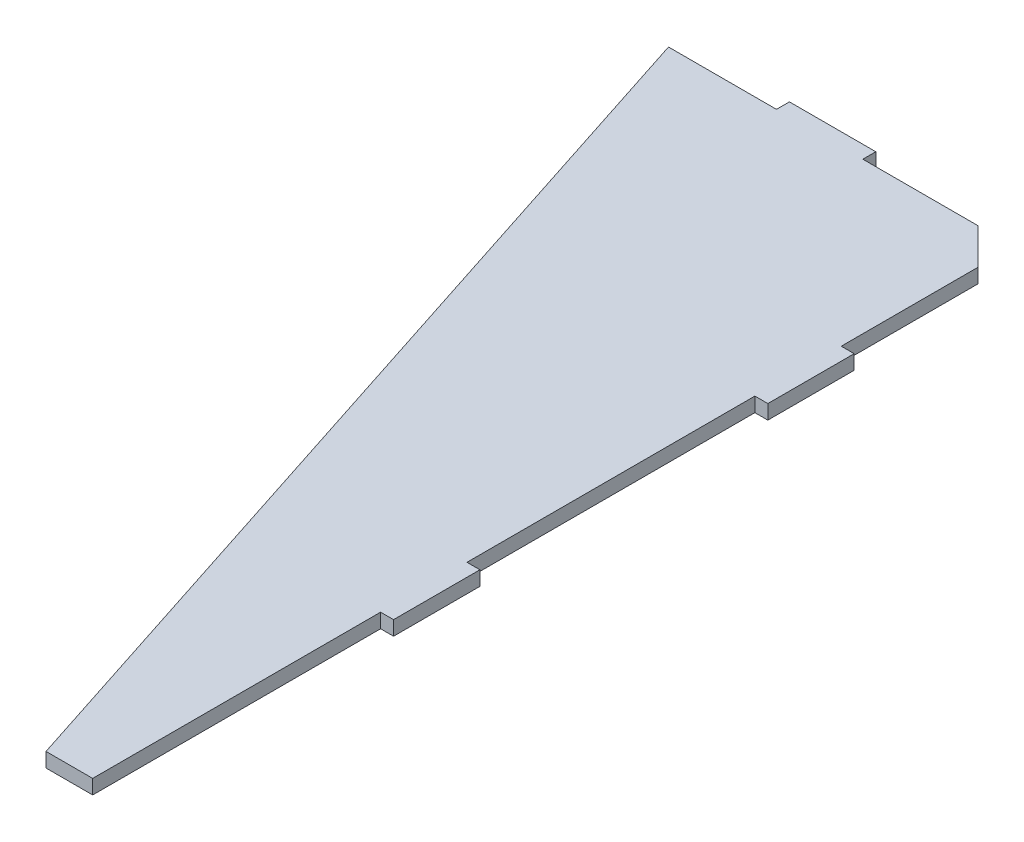
ISO-10303-21;
HEADER;
FILE_DESCRIPTION(('STEP AP214'),'2;1');
FILE_NAME('part.step','',(''),(''),'','','');
FILE_SCHEMA(('AUTOMOTIVE_DESIGN { 1 0 10303 214 1 1 1 1 }'));
ENDSEC;
DATA;
#1=APPLICATION_CONTEXT('core data for automotive mechanical design processes');
#2=APPLICATION_PROTOCOL_DEFINITION('international standard','automotive_design',2000,#1);
#3=PRODUCT_CONTEXT('',#1,'mechanical');
#4=PRODUCT('Part','Part','',(#3));
#5=PRODUCT_RELATED_PRODUCT_CATEGORY('part','',(#4));
#6=PRODUCT_DEFINITION_FORMATION('','',#4);
#7=PRODUCT_DEFINITION_CONTEXT('part definition',#1,'design');
#8=PRODUCT_DEFINITION('design','',#6,#7);
#9=PRODUCT_DEFINITION_SHAPE('','',#8);
#10=(LENGTH_UNIT() NAMED_UNIT(*) SI_UNIT(.MILLI.,.METRE.));
#11=(NAMED_UNIT(*) PLANE_ANGLE_UNIT() SI_UNIT($,.RADIAN.));
#12=(NAMED_UNIT(*) SI_UNIT($,.STERADIAN.) SOLID_ANGLE_UNIT());
#13=UNCERTAINTY_MEASURE_WITH_UNIT(LENGTH_MEASURE(1.E-05),#10,'distance_accuracy_value','');
#14=(GEOMETRIC_REPRESENTATION_CONTEXT(3) GLOBAL_UNCERTAINTY_ASSIGNED_CONTEXT((#13)) GLOBAL_UNIT_ASSIGNED_CONTEXT((#10,
#11,#12)) REPRESENTATION_CONTEXT('',''));
#15=CARTESIAN_POINT('',(0.,0.,0.));
#16=DIRECTION('',(0.,0.,1.));
#17=DIRECTION('',(1.,0.,0.));
#18=AXIS2_PLACEMENT_3D('',#15,#16,#17);
#19=CARTESIAN_POINT('',(-10395.380403508,-4534.39551359,-1295.999999995));
#20=DIRECTION('',(1.,0.,3.25232162851822E-11));
#21=DIRECTION('',(3.25232162851822E-11,0.,-1.));
#22=AXIS2_PLACEMENT_3D('',#19,#20,#21);
#23=PLANE('',#22);
#24=DIRECTION('',(0.,1.,0.));
#25=VECTOR('',#24,1.);
#26=CARTESIAN_POINT('',(-10395.380403504,-4536.39551359,-1347.999999995));
#27=LINE('',#26,#25);
#28=CARTESIAN_POINT('',(-10395.380403505,-4536.39551359,-1347.999999995));
#29=VERTEX_POINT('',#28);
#30=CARTESIAN_POINT('',(-10395.380403505,-4534.39551359,-1347.999999995));
#31=VERTEX_POINT('',#30);
#32=EDGE_CURVE('E34',#29,#31,#27,.T.);
#33=ORIENTED_EDGE('',*,*,#32,.F.);
#34=DIRECTION('',(-3.25144355883822E-11,0.,1.));
#35=VECTOR('',#34,1.);
#36=CARTESIAN_POINT('',(-10395.380403505,-4536.39551359,-1387.999999995));
#37=LINE('',#36,#35);
#38=CARTESIAN_POINT('',(-10395.3804035043,-4536.39551359,-1387.999999995));
#39=VERTEX_POINT('',#38);
#40=EDGE_CURVE('E255',#39,#29,#37,.T.);
#41=ORIENTED_EDGE('',*,*,#40,.F.);
#42=DIRECTION('',(0.,1.,0.));
#43=VECTOR('',#42,1.);
#44=CARTESIAN_POINT('',(-10395.380403504,-4536.39551359,-1387.999999995));
#45=LINE('',#44,#43);
#46=CARTESIAN_POINT('',(-10395.3804035047,-4534.39551359,-1387.999999995));
#47=VERTEX_POINT('',#46);
#48=EDGE_CURVE('E9',#39,#47,#45,.T.);
#49=ORIENTED_EDGE('',*,*,#48,.T.);
#50=DIRECTION('',(-3.25144355883822E-11,0.,1.));
#51=VECTOR('',#50,1.);
#52=CARTESIAN_POINT('',(-10395.380403505,-4534.39551359,-1387.999999995));
#53=LINE('',#52,#51);
#54=EDGE_CURVE('E25',#47,#31,#53,.T.);
#55=ORIENTED_EDGE('',*,*,#54,.T.);
#56=EDGE_LOOP('',(#33,#41,#49,#55));
#57=FACE_BOUND('',#56,.T.);
#58=ADVANCED_FACE('F15',(#57),#23,.T.);
#59=CARTESIAN_POINT('',(-10395.380403508,-4534.39551359,-1295.999999995));
#60=DIRECTION('',(1.,0.,3.25232162851822E-11));
#61=DIRECTION('',(3.25232162851822E-11,0.,-1.));
#62=AXIS2_PLACEMENT_3D('',#59,#60,#61);
#63=PLANE('',#62);
#64=DIRECTION('',(0.,1.,0.));
#65=VECTOR('',#64,1.);
#66=CARTESIAN_POINT('',(-10395.380403504,-4536.39551359,-1335.999999995));
#67=LINE('',#66,#65);
#68=CARTESIAN_POINT('',(-10395.3804035058,-4536.39551359,-1335.999999995));
#69=VERTEX_POINT('',#68);
#70=CARTESIAN_POINT('',(-10395.3804035052,-4534.39551359,-1335.999999995));
#71=VERTEX_POINT('',#70);
#72=EDGE_CURVE('E258',#69,#71,#67,.T.);
#73=ORIENTED_EDGE('',*,*,#72,.T.);
#74=DIRECTION('',(-3.25144355883822E-11,0.,1.));
#75=VECTOR('',#74,1.);
#76=CARTESIAN_POINT('',(-10395.3804035067,-4534.39551359,-1335.999999995));
#77=LINE('',#76,#75);
#78=CARTESIAN_POINT('',(-10395.380403508,-4534.39551359,-1295.999999995));
#79=VERTEX_POINT('',#78);
#80=EDGE_CURVE('E261',#71,#79,#77,.T.);
#81=ORIENTED_EDGE('',*,*,#80,.T.);
#82=DIRECTION('',(0.,-1.,0.));
#83=VECTOR('',#82,1.);
#84=CARTESIAN_POINT('',(-10395.380403508,-4534.39551359,-1295.999999995));
#85=LINE('',#84,#83);
#86=CARTESIAN_POINT('',(-10395.380403508,-4536.39551359,-1295.999999995));
#87=VERTEX_POINT('',#86);
#88=EDGE_CURVE('E264',#79,#87,#85,.T.);
#89=ORIENTED_EDGE('',*,*,#88,.T.);
#90=DIRECTION('',(-3.25144355883822E-11,0.,1.));
#91=VECTOR('',#90,1.);
#92=CARTESIAN_POINT('',(-10395.3804035067,-4536.39551359,-1335.999999995));
#93=LINE('',#92,#91);
#94=EDGE_CURVE('E222',#69,#87,#93,.T.);
#95=ORIENTED_EDGE('',*,*,#94,.F.);
#96=EDGE_LOOP('',(#73,#81,#89,#95));
#97=FACE_BOUND('',#96,.T.);
#98=ADVANCED_FACE('F311',(#97),#63,.T.);
#99=CARTESIAN_POINT('',(-10400.3804034904,-4534.39551359,-1423.9999999952));
#100=DIRECTION('',(1.11678108580692E-10,0.,-1.));
#101=DIRECTION('',(-1.,0.,-1.11678108580692E-10));
#102=AXIS2_PLACEMENT_3D('',#99,#100,#101);
#103=PLANE('',#102);
#104=DIRECTION('',(1.,0.,1.11679554384117E-10));
#105=VECTOR('',#104,1.);
#106=CARTESIAN_POINT('',(-10416.380403506,-4536.39551359,-1423.99999999698));
#107=LINE('',#106,#105);
#108=CARTESIAN_POINT('',(-10416.380403506,-4536.39551359,-1423.99999999844));
#109=VERTEX_POINT('',#108);
#110=CARTESIAN_POINT('',(-10400.3804034904,-4536.39551359,-1423.9999999952));
#111=VERTEX_POINT('',#110);
#112=EDGE_CURVE('E193',#109,#111,#107,.T.);
#113=ORIENTED_EDGE('',*,*,#112,.F.);
#114=DIRECTION('',(0.,1.,0.));
#115=VECTOR('',#114,1.);
#116=CARTESIAN_POINT('',(-10416.380403506,-4536.39551359,-1424.));
#117=LINE('',#116,#115);
#118=CARTESIAN_POINT('',(-10416.380403506,-4534.39551359,-1423.99999999832));
#119=VERTEX_POINT('',#118);
#120=EDGE_CURVE('E144',#109,#119,#117,.T.);
#121=ORIENTED_EDGE('',*,*,#120,.T.);
#122=DIRECTION('',(1.,0.,1.11679554384117E-10));
#123=VECTOR('',#122,1.);
#124=CARTESIAN_POINT('',(-10416.380403506,-4534.39551359,-1423.99999999698));
#125=LINE('',#124,#123);
#126=CARTESIAN_POINT('',(-10400.3804034904,-4534.39551359,-1423.9999999952));
#127=VERTEX_POINT('',#126);
#128=EDGE_CURVE('E270',#119,#127,#125,.T.);
#129=ORIENTED_EDGE('',*,*,#128,.T.);
#130=DIRECTION('',(0.,-1.,0.));
#131=VECTOR('',#130,1.);
#132=CARTESIAN_POINT('',(-10400.3804034904,-4534.39551359,-1423.9999999952));
#133=LINE('',#132,#131);
#134=EDGE_CURVE('E273',#127,#111,#133,.T.);
#135=ORIENTED_EDGE('',*,*,#134,.T.);
#136=EDGE_LOOP('',(#113,#121,#129,#135));
#137=FACE_BOUND('',#136,.T.);
#138=ADVANCED_FACE('F298',(#137),#103,.T.);
#139=CARTESIAN_POINT('',(-10395.380403508,-4534.39551359,-1295.999999995));
#140=DIRECTION('',(1.,0.,3.25232162851822E-11));
#141=DIRECTION('',(3.25232162851822E-11,0.,-1.));
#142=AXIS2_PLACEMENT_3D('',#139,#140,#141);
#143=PLANE('',#142);
#144=DIRECTION('',(0.,1.,0.));
#145=VECTOR('',#144,1.);
#146=CARTESIAN_POINT('',(-10395.380403504,-4536.39551359,-1399.999999995));
#147=LINE('',#146,#145);
#148=CARTESIAN_POINT('',(-10395.380403504,-4536.39551359,-1399.999999995));
#149=VERTEX_POINT('',#148);
#150=CARTESIAN_POINT('',(-10395.380403504,-4534.39551359,-1399.999999995));
#151=VERTEX_POINT('',#150);
#152=EDGE_CURVE('E163',#149,#151,#147,.T.);
#153=ORIENTED_EDGE('',*,*,#152,.F.);
#154=DIRECTION('',(-3.2550336734435E-11,0.,1.));
#155=VECTOR('',#154,1.);
#156=CARTESIAN_POINT('',(-10395.380403504,-4536.39551359,-1418.999999972));
#157=LINE('',#156,#155);
#158=CARTESIAN_POINT('',(-10395.380403504,-4536.39551359,-1418.999999972));
#159=VERTEX_POINT('',#158);
#160=EDGE_CURVE('E247',#159,#149,#157,.T.);
#161=ORIENTED_EDGE('',*,*,#160,.F.);
#162=DIRECTION('',(0.,-1.,0.));
#163=VECTOR('',#162,1.);
#164=CARTESIAN_POINT('',(-10395.380403504,-4534.39551359,-1418.999999972));
#165=LINE('',#164,#163);
#166=CARTESIAN_POINT('',(-10395.380403504,-4534.39551359,-1418.999999972));
#167=VERTEX_POINT('',#166);
#168=EDGE_CURVE('E210',#167,#159,#165,.T.);
#169=ORIENTED_EDGE('',*,*,#168,.F.);
#170=DIRECTION('',(-3.2550336734435E-11,0.,1.));
#171=VECTOR('',#170,1.);
#172=CARTESIAN_POINT('',(-10395.380403504,-4534.39551359,-1418.999999972));
#173=LINE('',#172,#171);
#174=EDGE_CURVE('E276',#167,#151,#173,.T.);
#175=ORIENTED_EDGE('',*,*,#174,.T.);
#176=EDGE_LOOP('',(#153,#161,#169,#175));
#177=FACE_BOUND('',#176,.T.);
#178=ADVANCED_FACE('F295',(#177),#143,.T.);
#179=CARTESIAN_POINT('',(-10400.3804034904,-4534.39551359,-1423.9999999952));
#180=DIRECTION('',(0.70710678378962,0.,-0.707106778583476));
#181=DIRECTION('',(-0.707106778583476,0.,-0.70710678378962));
#182=AXIS2_PLACEMENT_3D('',#179,#180,#181);
#183=PLANE('',#182);
#184=DIRECTION('',(0.70710677858346,0.,0.707106783789635));
#185=VECTOR('',#184,1.);
#186=CARTESIAN_POINT('',(-10400.3804034904,-4536.39551359,-1423.9999999952));
#187=LINE('',#186,#185);
#188=EDGE_CURVE('E190',#111,#159,#187,.T.);
#189=ORIENTED_EDGE('',*,*,#188,.F.);
#190=ORIENTED_EDGE('',*,*,#134,.F.);
#191=DIRECTION('',(0.70710677858346,0.,0.707106783789635));
#192=VECTOR('',#191,1.);
#193=CARTESIAN_POINT('',(-10400.3804034904,-4534.39551359,-1423.9999999952));
#194=LINE('',#193,#192);
#195=EDGE_CURVE('E199',#127,#167,#194,.T.);
#196=ORIENTED_EDGE('',*,*,#195,.T.);
#197=ORIENTED_EDGE('',*,*,#168,.T.);
#198=EDGE_LOOP('',(#189,#190,#196,#197));
#199=FACE_BOUND('',#198,.T.);
#200=ADVANCED_FACE('F288',(#199),#183,.T.);
#201=CARTESIAN_POINT('',(-10400.3804034904,-4534.39551359,-1423.9999999952));
#202=DIRECTION('',(1.11678108580692E-10,0.,-1.));
#203=DIRECTION('',(-1.,0.,-1.11678108580692E-10));
#204=AXIS2_PLACEMENT_3D('',#201,#202,#203);
#205=PLANE('',#204);
#206=DIRECTION('',(0.,1.,0.));
#207=VECTOR('',#206,1.);
#208=CARTESIAN_POINT('',(-10428.380403506,-4536.39551359,-1424.));
#209=LINE('',#208,#207);
#210=CARTESIAN_POINT('',(-10428.380403506,-4536.39551359,-1423.99999999926));
#211=VERTEX_POINT('',#210);
#212=CARTESIAN_POINT('',(-10428.380403506,-4534.39551359,-1423.99999999926));
#213=VERTEX_POINT('',#212);
#214=EDGE_CURVE('E154',#211,#213,#209,.T.);
#215=ORIENTED_EDGE('',*,*,#214,.F.);
#216=DIRECTION('',(1.,0.,1.11659422448897E-10));
#217=VECTOR('',#216,1.);
#218=CARTESIAN_POINT('',(-10443.380403506,-4536.39551359,-1424.));
#219=LINE('',#218,#217);
#220=CARTESIAN_POINT('',(-10443.380403506,-4536.39551359,-1424.));
#221=VERTEX_POINT('',#220);
#222=EDGE_CURVE('E200',#221,#211,#219,.T.);
#223=ORIENTED_EDGE('',*,*,#222,.F.);
#224=DIRECTION('',(0.,-1.,0.));
#225=VECTOR('',#224,1.);
#226=CARTESIAN_POINT('',(-10443.380403506,-4534.39551359,-1424.));
#227=LINE('',#226,#225);
#228=CARTESIAN_POINT('',(-10443.380403506,-4534.39551359,-1424.));
#229=VERTEX_POINT('',#228);
#230=EDGE_CURVE('E203',#229,#221,#227,.T.);
#231=ORIENTED_EDGE('',*,*,#230,.F.);
#232=DIRECTION('',(1.,0.,1.11659422448897E-10));
#233=VECTOR('',#232,1.);
#234=CARTESIAN_POINT('',(-10443.380403506,-4534.39551359,-1424.));
#235=LINE('',#234,#233);
#236=EDGE_CURVE('E208',#229,#213,#235,.T.);
#237=ORIENTED_EDGE('',*,*,#236,.T.);
#238=EDGE_LOOP('',(#215,#223,#231,#237));
#239=FACE_BOUND('',#238,.T.);
#240=ADVANCED_FACE('F325',(#239),#205,.T.);
#241=CARTESIAN_POINT('',(-10401.8668899915,-4534.39551359,-1296.));
#242=DIRECTION('',(-0.951222818946606,0.,0.308504698044085));
#243=DIRECTION('',(0.308504698044085,0.,0.951222818946606));
#244=AXIS2_PLACEMENT_3D('',#241,#242,#243);
#245=PLANE('',#244);
#246=DIRECTION('',(-0.308504698044076,0.,-0.951222818946609));
#247=VECTOR('',#246,1.);
#248=CARTESIAN_POINT('',(-10401.8668899915,-4536.39551359,-1296.));
#249=LINE('',#248,#247);
#250=CARTESIAN_POINT('',(-10401.8668899915,-4536.39551359,-1296.));
#251=VERTEX_POINT('',#250);
#252=EDGE_CURVE('E202',#251,#221,#249,.T.);
#253=ORIENTED_EDGE('',*,*,#252,.F.);
#254=DIRECTION('',(0.,-1.,0.));
#255=VECTOR('',#254,1.);
#256=CARTESIAN_POINT('',(-10401.8668899915,-4534.39551359,-1296.));
#257=LINE('',#256,#255);
#258=CARTESIAN_POINT('',(-10401.8668899915,-4534.39551359,-1296.));
#259=VERTEX_POINT('',#258);
#260=EDGE_CURVE('E214',#259,#251,#257,.T.);
#261=ORIENTED_EDGE('',*,*,#260,.F.);
#262=DIRECTION('',(-0.308504698044076,0.,-0.951222818946609));
#263=VECTOR('',#262,1.);
#264=CARTESIAN_POINT('',(-10401.8668899915,-4534.39551359,-1296.));
#265=LINE('',#264,#263);
#266=EDGE_CURVE('E206',#259,#229,#265,.T.);
#267=ORIENTED_EDGE('',*,*,#266,.T.);
#268=ORIENTED_EDGE('',*,*,#230,.T.);
#269=EDGE_LOOP('',(#253,#261,#267,#268));
#270=FACE_BOUND('',#269,.T.);
#271=ADVANCED_FACE('F328',(#270),#245,.T.);
#272=CARTESIAN_POINT('',(-10395.380403508,-4534.39551359,-1295.999999995));
#273=DIRECTION('',(-7.70833397467547E-10,0.,1.));
#274=DIRECTION('',(1.,0.,7.70833397467547E-10));
#275=AXIS2_PLACEMENT_3D('',#272,#273,#274);
#276=PLANE('',#275);
#277=DIRECTION('',(-1.,0.,-7.70825181816899E-10));
#278=VECTOR('',#277,1.);
#279=CARTESIAN_POINT('',(-10395.380403508,-4536.39551359,-1295.999999995));
#280=LINE('',#279,#278);
#281=EDGE_CURVE('E213',#87,#251,#280,.T.);
#282=ORIENTED_EDGE('',*,*,#281,.F.);
#283=ORIENTED_EDGE('',*,*,#88,.F.);
#284=DIRECTION('',(-1.,0.,-7.70825181816899E-10));
#285=VECTOR('',#284,1.);
#286=CARTESIAN_POINT('',(-10395.380403508,-4534.39551359,-1295.999999995));
#287=LINE('',#286,#285);
#288=EDGE_CURVE('E207',#79,#259,#287,.T.);
#289=ORIENTED_EDGE('',*,*,#288,.T.);
#290=ORIENTED_EDGE('',*,*,#260,.T.);
#291=EDGE_LOOP('',(#282,#283,#289,#290));
#292=FACE_BOUND('',#291,.T.);
#293=ADVANCED_FACE('F332',(#292),#276,.T.);
#294=CARTESIAN_POINT('',(0.,-4534.39551359,0.));
#295=DIRECTION('',(0.,1.,0.));
#296=DIRECTION('',(0.,0.,1.));
#297=AXIS2_PLACEMENT_3D('',#294,#295,#296);
#298=PLANE('',#297);
#299=ORIENTED_EDGE('',*,*,#174,.F.);
#300=ORIENTED_EDGE('',*,*,#195,.F.);
#301=ORIENTED_EDGE('',*,*,#128,.F.);
#302=DIRECTION('',(0.,0.,-1.));
#303=VECTOR('',#302,1.);
#304=CARTESIAN_POINT('',(-10416.380403506,-4534.39551359,-1423.99999999698));
#305=LINE('',#304,#303);
#306=CARTESIAN_POINT('',(-10416.380403506,-4534.39551359,-1425.8));
#307=VERTEX_POINT('',#306);
#308=EDGE_CURVE('E217',#119,#307,#305,.T.);
#309=ORIENTED_EDGE('',*,*,#308,.T.);
#310=DIRECTION('',(-1.,0.,0.));
#311=VECTOR('',#310,1.);
#312=CARTESIAN_POINT('',(-10416.380403506,-4534.39551359,-1425.8));
#313=LINE('',#312,#311);
#314=CARTESIAN_POINT('',(-10428.380403506,-4534.39551359,-1425.8));
#315=VERTEX_POINT('',#314);
#316=EDGE_CURVE('E158',#307,#315,#313,.T.);
#317=ORIENTED_EDGE('',*,*,#316,.T.);
#318=DIRECTION('',(0.,0.,1.));
#319=VECTOR('',#318,1.);
#320=CARTESIAN_POINT('',(-10428.380403506,-4534.39551359,-1425.8));
#321=LINE('',#320,#319);
#322=EDGE_CURVE('E227',#315,#213,#321,.T.);
#323=ORIENTED_EDGE('',*,*,#322,.T.);
#324=ORIENTED_EDGE('',*,*,#236,.F.);
#325=ORIENTED_EDGE('',*,*,#266,.F.);
#326=ORIENTED_EDGE('',*,*,#288,.F.);
#327=ORIENTED_EDGE('',*,*,#80,.F.);
#328=DIRECTION('',(1.,0.,0.));
#329=VECTOR('',#328,1.);
#330=CARTESIAN_POINT('',(-10395.380403504,-4534.39551359,-1335.999999995));
#331=LINE('',#330,#329);
#332=CARTESIAN_POINT('',(-10393.580403504,-4534.39551359,-1335.999999995));
#333=VERTEX_POINT('',#332);
#334=EDGE_CURVE('E230',#71,#333,#331,.T.);
#335=ORIENTED_EDGE('',*,*,#334,.T.);
#336=DIRECTION('',(0.,0.,-1.));
#337=VECTOR('',#336,1.);
#338=CARTESIAN_POINT('',(-10393.580403504,-4534.39551359,-1335.999999995));
#339=LINE('',#338,#337);
#340=CARTESIAN_POINT('',(-10393.580403504,-4534.39551359,-1347.999999995));
#341=VERTEX_POINT('',#340);
#342=EDGE_CURVE('E233',#333,#341,#339,.T.);
#343=ORIENTED_EDGE('',*,*,#342,.T.);
#344=DIRECTION('',(-1.,0.,0.));
#345=VECTOR('',#344,1.);
#346=CARTESIAN_POINT('',(-10393.580403504,-4534.39551359,-1347.999999995));
#347=LINE('',#346,#345);
#348=EDGE_CURVE('E236',#341,#31,#347,.T.);
#349=ORIENTED_EDGE('',*,*,#348,.T.);
#350=ORIENTED_EDGE('',*,*,#54,.F.);
#351=DIRECTION('',(1.,0.,0.));
#352=VECTOR('',#351,1.);
#353=CARTESIAN_POINT('',(-10395.380403505,-4534.39551359,-1387.999999995));
#354=LINE('',#353,#352);
#355=CARTESIAN_POINT('',(-10393.580403504,-4534.39551359,-1387.999999995));
#356=VERTEX_POINT('',#355);
#357=EDGE_CURVE('E239',#47,#356,#354,.T.);
#358=ORIENTED_EDGE('',*,*,#357,.T.);
#359=DIRECTION('',(0.,0.,-1.));
#360=VECTOR('',#359,1.);
#361=CARTESIAN_POINT('',(-10393.580403504,-4534.39551359,-1387.999999995));
#362=LINE('',#361,#360);
#363=CARTESIAN_POINT('',(-10393.580403504,-4534.39551359,-1399.999999995));
#364=VERTEX_POINT('',#363);
#365=EDGE_CURVE('E242',#356,#364,#362,.T.);
#366=ORIENTED_EDGE('',*,*,#365,.T.);
#367=DIRECTION('',(-1.,0.,0.));
#368=VECTOR('',#367,1.);
#369=CARTESIAN_POINT('',(-10393.580403504,-4534.39551359,-1399.999999995));
#370=LINE('',#369,#368);
#371=EDGE_CURVE('E245',#364,#151,#370,.T.);
#372=ORIENTED_EDGE('',*,*,#371,.T.);
#373=EDGE_LOOP('',(#299,#300,#301,#309,#317,#323,#324,#325,#326,#327,#335,#343,#349,#350,#358,
#366,#372));
#374=FACE_BOUND('',#373,.T.);
#375=ADVANCED_FACE('F290',(#374),#298,.T.);
#376=CARTESIAN_POINT('',(0.,-4536.39551359,0.));
#377=DIRECTION('',(0.,1.,0.));
#378=DIRECTION('',(0.,0.,1.));
#379=AXIS2_PLACEMENT_3D('',#376,#377,#378);
#380=PLANE('',#379);
#381=ORIENTED_EDGE('',*,*,#160,.T.);
#382=DIRECTION('',(-1.,0.,0.));
#383=VECTOR('',#382,1.);
#384=CARTESIAN_POINT('',(-10393.580403504,-4536.39551359,-1399.999999995));
#385=LINE('',#384,#383);
#386=CARTESIAN_POINT('',(-10393.580403504,-4536.39551359,-1399.999999995));
#387=VERTEX_POINT('',#386);
#388=EDGE_CURVE('E160',#387,#149,#385,.T.);
#389=ORIENTED_EDGE('',*,*,#388,.F.);
#390=DIRECTION('',(0.,0.,-1.));
#391=VECTOR('',#390,1.);
#392=CARTESIAN_POINT('',(-10393.580403504,-4536.39551359,-1387.999999995));
#393=LINE('',#392,#391);
#394=CARTESIAN_POINT('',(-10393.580403504,-4536.39551359,-1387.999999995));
#395=VERTEX_POINT('',#394);
#396=EDGE_CURVE('E170',#395,#387,#393,.T.);
#397=ORIENTED_EDGE('',*,*,#396,.F.);
#398=DIRECTION('',(1.,0.,0.));
#399=VECTOR('',#398,1.);
#400=CARTESIAN_POINT('',(-10395.380403504,-4536.39551359,-1387.999999995));
#401=LINE('',#400,#399);
#402=EDGE_CURVE('E171',#39,#395,#401,.T.);
#403=ORIENTED_EDGE('',*,*,#402,.F.);
#404=ORIENTED_EDGE('',*,*,#40,.T.);
#405=DIRECTION('',(-1.,0.,0.));
#406=VECTOR('',#405,1.);
#407=CARTESIAN_POINT('',(-10393.580403504,-4536.39551359,-1347.999999995));
#408=LINE('',#407,#406);
#409=CARTESIAN_POINT('',(-10393.580403504,-4536.39551359,-1347.999999995));
#410=VERTEX_POINT('',#409);
#411=EDGE_CURVE('E174',#410,#29,#408,.T.);
#412=ORIENTED_EDGE('',*,*,#411,.F.);
#413=DIRECTION('',(0.,0.,-1.));
#414=VECTOR('',#413,1.);
#415=CARTESIAN_POINT('',(-10393.580403504,-4536.39551359,-1335.999999995));
#416=LINE('',#415,#414);
#417=CARTESIAN_POINT('',(-10393.580403504,-4536.39551359,-1335.999999995));
#418=VERTEX_POINT('',#417);
#419=EDGE_CURVE('E177',#418,#410,#416,.T.);
#420=ORIENTED_EDGE('',*,*,#419,.F.);
#421=DIRECTION('',(1.,0.,0.));
#422=VECTOR('',#421,1.);
#423=CARTESIAN_POINT('',(-10395.3804035067,-4536.39551359,-1335.999999995));
#424=LINE('',#423,#422);
#425=EDGE_CURVE('E178',#69,#418,#424,.T.);
#426=ORIENTED_EDGE('',*,*,#425,.F.);
#427=ORIENTED_EDGE('',*,*,#94,.T.);
#428=ORIENTED_EDGE('',*,*,#281,.T.);
#429=ORIENTED_EDGE('',*,*,#252,.T.);
#430=ORIENTED_EDGE('',*,*,#222,.T.);
#431=DIRECTION('',(0.,0.,1.));
#432=VECTOR('',#431,1.);
#433=CARTESIAN_POINT('',(-10428.380403506,-4536.39551359,-1425.8));
#434=LINE('',#433,#432);
#435=CARTESIAN_POINT('',(-10428.380403506,-4536.39551359,-1425.8));
#436=VERTEX_POINT('',#435);
#437=EDGE_CURVE('E152',#436,#211,#434,.T.);
#438=ORIENTED_EDGE('',*,*,#437,.F.);
#439=DIRECTION('',(-1.,0.,0.));
#440=VECTOR('',#439,1.);
#441=CARTESIAN_POINT('',(-10416.380403506,-4536.39551359,-1425.8));
#442=LINE('',#441,#440);
#443=CARTESIAN_POINT('',(-10416.380403506,-4536.39551359,-1425.8));
#444=VERTEX_POINT('',#443);
#445=EDGE_CURVE('E132',#444,#436,#442,.T.);
#446=ORIENTED_EDGE('',*,*,#445,.F.);
#447=DIRECTION('',(0.,0.,-1.));
#448=VECTOR('',#447,1.);
#449=CARTESIAN_POINT('',(-10416.380403506,-4536.39551359,-1424.));
#450=LINE('',#449,#448);
#451=EDGE_CURVE('E139',#109,#444,#450,.T.);
#452=ORIENTED_EDGE('',*,*,#451,.F.);
#453=ORIENTED_EDGE('',*,*,#112,.T.);
#454=ORIENTED_EDGE('',*,*,#188,.T.);
#455=EDGE_LOOP('',(#381,#389,#397,#403,#404,#412,#420,#426,#427,#428,#429,#430,#438,#446,#452,
#453,#454));
#456=FACE_BOUND('',#455,.T.);
#457=ADVANCED_FACE('F149',(#456),#380,.F.);
#458=CARTESIAN_POINT('',(-10428.380403506,-4536.39551359,-1424.));
#459=DIRECTION('',(-1.,0.,0.));
#460=DIRECTION('',(0.,0.,1.));
#461=AXIS2_PLACEMENT_3D('',#458,#459,#460);
#462=PLANE('',#461);
#463=ORIENTED_EDGE('',*,*,#322,.F.);
#464=DIRECTION('',(0.,1.,0.));
#465=VECTOR('',#464,1.);
#466=CARTESIAN_POINT('',(-10428.380403506,-4536.39551359,-1425.8));
#467=LINE('',#466,#465);
#468=EDGE_CURVE('E146',#436,#315,#467,.T.);
#469=ORIENTED_EDGE('',*,*,#468,.F.);
#470=ORIENTED_EDGE('',*,*,#437,.T.);
#471=ORIENTED_EDGE('',*,*,#214,.T.);
#472=EDGE_LOOP('',(#463,#469,#470,#471));
#473=FACE_BOUND('',#472,.T.);
#474=ADVANCED_FACE('F300',(#473),#462,.T.);
#475=CARTESIAN_POINT('',(-10428.380403506,-4536.39551359,-1425.8));
#476=DIRECTION('',(0.,0.,-1.));
#477=DIRECTION('',(-1.,0.,0.));
#478=AXIS2_PLACEMENT_3D('',#475,#476,#477);
#479=PLANE('',#478);
#480=ORIENTED_EDGE('',*,*,#316,.F.);
#481=DIRECTION('',(0.,1.,0.));
#482=VECTOR('',#481,1.);
#483=CARTESIAN_POINT('',(-10416.380403506,-4536.39551359,-1425.8));
#484=LINE('',#483,#482);
#485=EDGE_CURVE('E142',#444,#307,#484,.T.);
#486=ORIENTED_EDGE('',*,*,#485,.F.);
#487=ORIENTED_EDGE('',*,*,#445,.T.);
#488=ORIENTED_EDGE('',*,*,#468,.T.);
#489=EDGE_LOOP('',(#480,#486,#487,#488));
#490=FACE_BOUND('',#489,.T.);
#491=ADVANCED_FACE('F156',(#490),#479,.T.);
#492=CARTESIAN_POINT('',(-10416.380403506,-4536.39551359,-1424.));
#493=DIRECTION('',(1.,0.,0.));
#494=DIRECTION('',(0.,0.,-1.));
#495=AXIS2_PLACEMENT_3D('',#492,#493,#494);
#496=PLANE('',#495);
#497=ORIENTED_EDGE('',*,*,#308,.F.);
#498=ORIENTED_EDGE('',*,*,#120,.F.);
#499=ORIENTED_EDGE('',*,*,#451,.T.);
#500=ORIENTED_EDGE('',*,*,#485,.T.);
#501=EDGE_LOOP('',(#497,#498,#499,#500));
#502=FACE_BOUND('',#501,.T.);
#503=ADVANCED_FACE('F141',(#502),#496,.T.);
#504=CARTESIAN_POINT('',(-10395.380403504,-4536.39551359,-1399.999999995));
#505=DIRECTION('',(0.,0.,-1.));
#506=DIRECTION('',(-1.,0.,0.));
#507=AXIS2_PLACEMENT_3D('',#504,#505,#506);
#508=PLANE('',#507);
#509=ORIENTED_EDGE('',*,*,#371,.F.);
#510=DIRECTION('',(0.,1.,0.));
#511=VECTOR('',#510,1.);
#512=CARTESIAN_POINT('',(-10393.580403504,-4536.39551359,-1399.999999995));
#513=LINE('',#512,#511);
#514=EDGE_CURVE('E167',#387,#364,#513,.T.);
#515=ORIENTED_EDGE('',*,*,#514,.F.);
#516=ORIENTED_EDGE('',*,*,#388,.T.);
#517=ORIENTED_EDGE('',*,*,#152,.T.);
#518=EDGE_LOOP('',(#509,#515,#516,#517));
#519=FACE_BOUND('',#518,.T.);
#520=ADVANCED_FACE('F293',(#519),#508,.T.);
#521=CARTESIAN_POINT('',(-10393.580403504,-4536.39551359,-1399.999999995));
#522=DIRECTION('',(1.,0.,0.));
#523=DIRECTION('',(0.,0.,-1.));
#524=AXIS2_PLACEMENT_3D('',#521,#522,#523);
#525=PLANE('',#524);
#526=ORIENTED_EDGE('',*,*,#365,.F.);
#527=DIRECTION('',(0.,1.,0.));
#528=VECTOR('',#527,1.);
#529=CARTESIAN_POINT('',(-10393.580403504,-4536.39551359,-1387.999999995));
#530=LINE('',#529,#528);
#531=EDGE_CURVE('E172',#395,#356,#530,.T.);
#532=ORIENTED_EDGE('',*,*,#531,.F.);
#533=ORIENTED_EDGE('',*,*,#396,.T.);
#534=ORIENTED_EDGE('',*,*,#514,.T.);
#535=EDGE_LOOP('',(#526,#532,#533,#534));
#536=FACE_BOUND('',#535,.T.);
#537=ADVANCED_FACE('F378',(#536),#525,.T.);
#538=CARTESIAN_POINT('',(-10395.380403504,-4536.39551359,-1387.999999995));
#539=DIRECTION('',(0.,0.,1.));
#540=DIRECTION('',(1.,0.,0.));
#541=AXIS2_PLACEMENT_3D('',#538,#539,#540);
#542=PLANE('',#541);
#543=ORIENTED_EDGE('',*,*,#357,.F.);
#544=ORIENTED_EDGE('',*,*,#48,.F.);
#545=ORIENTED_EDGE('',*,*,#402,.T.);
#546=ORIENTED_EDGE('',*,*,#531,.T.);
#547=EDGE_LOOP('',(#543,#544,#545,#546));
#548=FACE_BOUND('',#547,.T.);
#549=ADVANCED_FACE('F387',(#548),#542,.T.);
#550=CARTESIAN_POINT('',(-10395.380403504,-4536.39551359,-1347.999999995));
#551=DIRECTION('',(0.,0.,-1.));
#552=DIRECTION('',(-1.,0.,0.));
#553=AXIS2_PLACEMENT_3D('',#550,#551,#552);
#554=PLANE('',#553);
#555=ORIENTED_EDGE('',*,*,#348,.F.);
#556=DIRECTION('',(0.,1.,0.));
#557=VECTOR('',#556,1.);
#558=CARTESIAN_POINT('',(-10393.580403504,-4536.39551359,-1347.999999995));
#559=LINE('',#558,#557);
#560=EDGE_CURVE('E175',#410,#341,#559,.T.);
#561=ORIENTED_EDGE('',*,*,#560,.F.);
#562=ORIENTED_EDGE('',*,*,#411,.T.);
#563=ORIENTED_EDGE('',*,*,#32,.T.);
#564=EDGE_LOOP('',(#555,#561,#562,#563));
#565=FACE_BOUND('',#564,.T.);
#566=ADVANCED_FACE('F397',(#565),#554,.T.);
#567=CARTESIAN_POINT('',(-10393.580403504,-4536.39551359,-1347.999999995));
#568=DIRECTION('',(1.,0.,0.));
#569=DIRECTION('',(0.,0.,-1.));
#570=AXIS2_PLACEMENT_3D('',#567,#568,#569);
#571=PLANE('',#570);
#572=ORIENTED_EDGE('',*,*,#342,.F.);
#573=DIRECTION('',(0.,1.,0.));
#574=VECTOR('',#573,1.);
#575=CARTESIAN_POINT('',(-10393.580403504,-4536.39551359,-1335.999999995));
#576=LINE('',#575,#574);
#577=EDGE_CURVE('E19',#418,#333,#576,.T.);
#578=ORIENTED_EDGE('',*,*,#577,.F.);
#579=ORIENTED_EDGE('',*,*,#419,.T.);
#580=ORIENTED_EDGE('',*,*,#560,.T.);
#581=EDGE_LOOP('',(#572,#578,#579,#580));
#582=FACE_BOUND('',#581,.T.);
#583=ADVANCED_FACE('F407',(#582),#571,.T.);
#584=CARTESIAN_POINT('',(-10395.380403504,-4536.39551359,-1335.999999995));
#585=DIRECTION('',(0.,0.,1.));
#586=DIRECTION('',(1.,0.,0.));
#587=AXIS2_PLACEMENT_3D('',#584,#585,#586);
#588=PLANE('',#587);
#589=ORIENTED_EDGE('',*,*,#334,.F.);
#590=ORIENTED_EDGE('',*,*,#72,.F.);
#591=ORIENTED_EDGE('',*,*,#425,.T.);
#592=ORIENTED_EDGE('',*,*,#577,.T.);
#593=EDGE_LOOP('',(#589,#590,#591,#592));
#594=FACE_BOUND('',#593,.T.);
#595=ADVANCED_FACE('F17',(#594),#588,.T.);
#596=CLOSED_SHELL('',(#58,#98,#138,#178,#200,#240,#271,#293,#375,#457,#474,#491,#503,#520,#537,
#549,#566,#583,#595));
#597=MANIFOLD_SOLID_BREP('B1',#596);
#598=ADVANCED_BREP_SHAPE_REPRESENTATION('',(#18,#597),#14);
#599=SHAPE_DEFINITION_REPRESENTATION(#9,#598);
ENDSEC;
END-ISO-10303-21;
